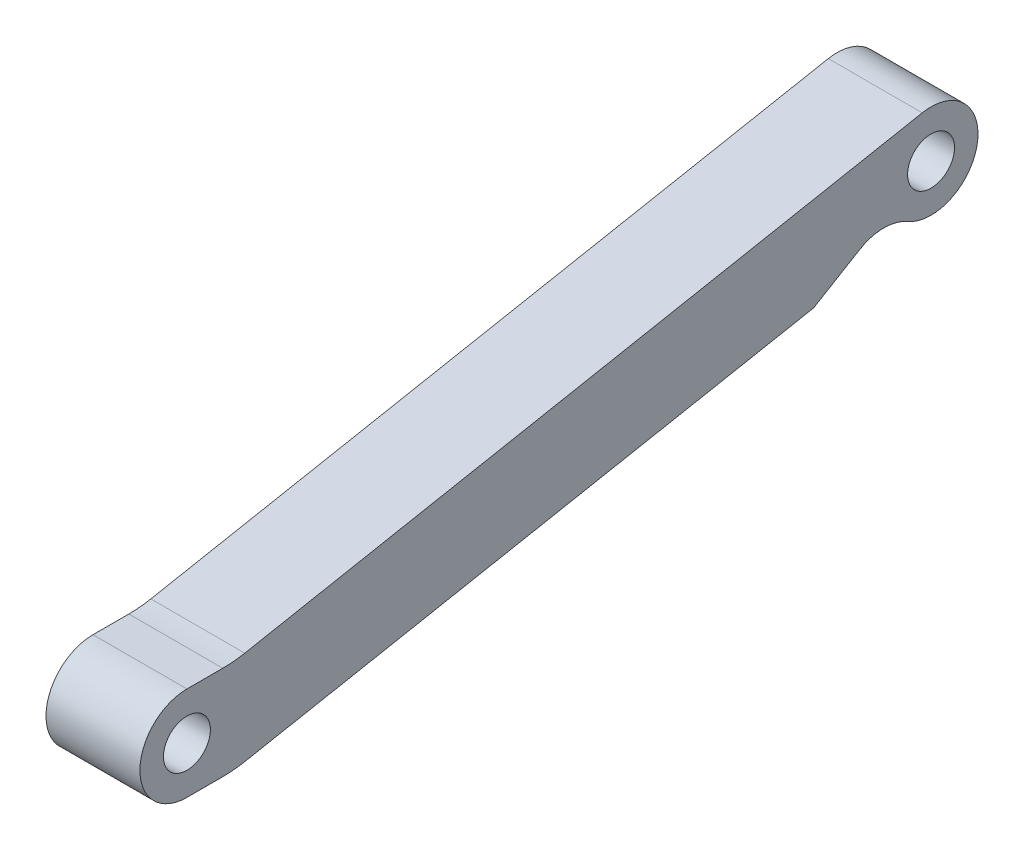
ISO-10303-21;
HEADER;
FILE_DESCRIPTION(('STEP AP214'),'2;1');
FILE_NAME('part.step','',(''),(''),'','','');
FILE_SCHEMA(('AUTOMOTIVE_DESIGN { 1 0 10303 214 1 1 1 1 }'));
ENDSEC;
DATA;
#1=APPLICATION_CONTEXT('core data for automotive mechanical design processes');
#2=APPLICATION_PROTOCOL_DEFINITION('international standard','automotive_design',2000,#1);
#3=PRODUCT_CONTEXT('',#1,'mechanical');
#4=PRODUCT('Part','Part','',(#3));
#5=PRODUCT_RELATED_PRODUCT_CATEGORY('part','',(#4));
#6=PRODUCT_DEFINITION_FORMATION('','',#4);
#7=PRODUCT_DEFINITION_CONTEXT('part definition',#1,'design');
#8=PRODUCT_DEFINITION('design','',#6,#7);
#9=PRODUCT_DEFINITION_SHAPE('','',#8);
#10=(LENGTH_UNIT() NAMED_UNIT(*) SI_UNIT(.MILLI.,.METRE.));
#11=(NAMED_UNIT(*) PLANE_ANGLE_UNIT() SI_UNIT($,.RADIAN.));
#12=(NAMED_UNIT(*) SI_UNIT($,.STERADIAN.) SOLID_ANGLE_UNIT());
#13=UNCERTAINTY_MEASURE_WITH_UNIT(LENGTH_MEASURE(1.E-05),#10,'distance_accuracy_value','');
#14=(GEOMETRIC_REPRESENTATION_CONTEXT(3) GLOBAL_UNCERTAINTY_ASSIGNED_CONTEXT((#13)) GLOBAL_UNIT_ASSIGNED_CONTEXT((#10,
#11,#12)) REPRESENTATION_CONTEXT('',''));
#15=CARTESIAN_POINT('',(0.,0.,0.));
#16=DIRECTION('',(0.,0.,1.));
#17=DIRECTION('',(1.,0.,0.));
#18=AXIS2_PLACEMENT_3D('',#15,#16,#17);
#19=CARTESIAN_POINT('',(-2.,-1.83592650414408,-78.7384748278499));
#20=DIRECTION('',(1.,0.,0.));
#21=DIRECTION('',(0.,0.,-1.));
#22=AXIS2_PLACEMENT_3D('',#19,#20,#21);
#23=CYLINDRICAL_SURFACE('',#22,2.00000000000001);
#24=DIRECTION('',(1.,0.,0.));
#25=VECTOR('',#24,1.);
#26=CARTESIAN_POINT('',(-2.,-0.105463252072049,-79.7412195277752));
#27=LINE('',#26,#25);
#28=CARTESIAN_POINT('',(-2.,-0.105463252072049,-79.7412195277752));
#29=VERTEX_POINT('',#28);
#30=CARTESIAN_POINT('',(2.,-0.105463252072049,-79.7412195277752));
#31=VERTEX_POINT('',#30);
#32=EDGE_CURVE('E42',#29,#31,#27,.T.);
#33=ORIENTED_EDGE('',*,*,#32,.T.);
#34=CARTESIAN_POINT('',(2.,-1.83592650414408,-78.7384748278499));
#35=DIRECTION('',(1.,0.,0.));
#36=DIRECTION('',(0.,0.,-1.));
#37=AXIS2_PLACEMENT_3D('',#34,#35,#36);
#38=CIRCLE('',#37,2.00000000000001);
#39=CARTESIAN_POINT('',(2.,-0.117948325049931,-77.7144870465964));
#40=VERTEX_POINT('',#39);
#41=EDGE_CURVE('E119',#31,#40,#38,.T.);
#42=ORIENTED_EDGE('',*,*,#41,.T.);
#43=DIRECTION('',(1.,0.,0.));
#44=VECTOR('',#43,1.);
#45=CARTESIAN_POINT('',(-2.,-0.117948325049931,-77.7144870465964));
#46=LINE('',#45,#44);
#47=CARTESIAN_POINT('',(-2.,-0.117948325049931,-77.7144870465964));
#48=VERTEX_POINT('',#47);
#49=EDGE_CURVE('E11',#48,#40,#46,.T.);
#50=ORIENTED_EDGE('',*,*,#49,.F.);
#51=CARTESIAN_POINT('',(-2.,-1.83592650414408,-78.7384748278499));
#52=DIRECTION('',(1.,0.,0.));
#53=DIRECTION('',(0.,0.,-1.));
#54=AXIS2_PLACEMENT_3D('',#51,#52,#53);
#55=CIRCLE('',#54,2.00000000000001);
#56=EDGE_CURVE('E55',#29,#48,#55,.T.);
#57=ORIENTED_EDGE('',*,*,#56,.F.);
#58=EDGE_LOOP('',(#33,#42,#50,#57));
#59=FACE_BOUND('',#58,.T.);
#60=ADVANCED_FACE('F38',(#59),#23,.F.);
#61=CARTESIAN_POINT('',(-2.,-34.2656407745785,-20.4237736526372));
#62=DIRECTION('',(0.,-0.858989089547071,-0.511993890626728));
#63=DIRECTION('',(0.,0.511993890626728,-0.858989089547071));
#64=AXIS2_PLACEMENT_3D('',#61,#62,#63);
#65=PLANE('',#64);
#66=ORIENTED_EDGE('',*,*,#49,.T.);
#67=DIRECTION('',(0.,0.511993890626728,-0.858989089547071));
#68=VECTOR('',#67,1.);
#69=CARTESIAN_POINT('',(2.,-34.2656407745785,-20.4237736526372));
#70=LINE('',#69,#68);
#71=CARTESIAN_POINT('',(2.,-1.29246341132096,-75.7439642277005));
#72=VERTEX_POINT('',#71);
#73=EDGE_CURVE('E136',#72,#40,#70,.T.);
#74=ORIENTED_EDGE('',*,*,#73,.F.);
#75=DIRECTION('',(1.,0.,0.));
#76=VECTOR('',#75,1.);
#77=CARTESIAN_POINT('',(-2.,-1.29246341132096,-75.7439642277005));
#78=LINE('',#77,#76);
#79=CARTESIAN_POINT('',(-2.,-1.29246341132096,-75.7439642277005));
#80=VERTEX_POINT('',#79);
#81=EDGE_CURVE('E47',#80,#72,#78,.T.);
#82=ORIENTED_EDGE('',*,*,#81,.F.);
#83=DIRECTION('',(0.,0.511993890626728,-0.858989089547071));
#84=VECTOR('',#83,1.);
#85=CARTESIAN_POINT('',(-2.,-34.2656407745785,-20.4237736526372));
#86=LINE('',#85,#84);
#87=EDGE_CURVE('E123',#80,#48,#86,.T.);
#88=ORIENTED_EDGE('',*,*,#87,.T.);
#89=EDGE_LOOP('',(#66,#74,#82,#88));
#90=FACE_BOUND('',#89,.T.);
#91=ADVANCED_FACE('F231',(#90),#65,.T.);
#92=CARTESIAN_POINT('',(-2.,-15.184700993753,-2.89573938527255));
#93=DIRECTION('',(0.,-0.98229793263701,-0.187325309387324));
#94=DIRECTION('',(0.,0.187325309387324,-0.98229793263701));
#95=AXIS2_PLACEMENT_3D('',#92,#93,#94);
#96=PLANE('',#95);
#97=ORIENTED_EDGE('',*,*,#81,.T.);
#98=DIRECTION('',(0.,0.187325309387324,-0.98229793263701));
#99=VECTOR('',#98,1.);
#100=CARTESIAN_POINT('',(2.,-15.184700993753,-2.89573938527255));
#101=LINE('',#100,#99);
#102=CARTESIAN_POINT('',(2.,-5.91148966318505,-51.5226779912492));
#103=VERTEX_POINT('',#102);
#104=EDGE_CURVE('E160',#103,#72,#101,.T.);
#105=ORIENTED_EDGE('',*,*,#104,.F.);
#106=DIRECTION('',(1.,0.,0.));
#107=VECTOR('',#106,1.);
#108=CARTESIAN_POINT('',(-2.,-5.91148966318505,-51.5226779912492));
#109=LINE('',#108,#107);
#110=CARTESIAN_POINT('',(-2.,-5.91148966318505,-51.5226779912492));
#111=VERTEX_POINT('',#110);
#112=EDGE_CURVE('E191',#111,#103,#109,.T.);
#113=ORIENTED_EDGE('',*,*,#112,.F.);
#114=DIRECTION('',(0.,0.187325309387324,-0.98229793263701));
#115=VECTOR('',#114,1.);
#116=CARTESIAN_POINT('',(-2.,-15.184700993753,-2.89573938527255));
#117=LINE('',#116,#115);
#118=EDGE_CURVE('E187',#111,#80,#117,.T.);
#119=ORIENTED_EDGE('',*,*,#118,.T.);
#120=EDGE_LOOP('',(#97,#105,#113,#119));
#121=FACE_BOUND('',#120,.T.);
#122=ADVANCED_FACE('F229',(#121),#96,.T.);
#123=CARTESIAN_POINT('',(-2.,-1.00000000000001,-50.5860514443126));
#124=DIRECTION('',(1.,0.,0.));
#125=DIRECTION('',(0.,0.,-1.));
#126=AXIS2_PLACEMENT_3D('',#123,#124,#125);
#127=CYLINDRICAL_SURFACE('',#126,5.);
#128=ORIENTED_EDGE('',*,*,#112,.T.);
#129=CARTESIAN_POINT('',(2.,-1.00000000000001,-50.5860514443126));
#130=DIRECTION('',(1.,0.,0.));
#131=DIRECTION('',(0.,0.,-1.));
#132=AXIS2_PLACEMENT_3D('',#129,#130,#131);
#133=CIRCLE('',#132,5.);
#134=CARTESIAN_POINT('',(2.,-6.00000000000001,-50.5860514443126));
#135=VERTEX_POINT('',#134);
#136=EDGE_CURVE('E157',#135,#103,#133,.T.);
#137=ORIENTED_EDGE('',*,*,#136,.F.);
#138=DIRECTION('',(1.,0.,0.));
#139=VECTOR('',#138,1.);
#140=CARTESIAN_POINT('',(-2.,-6.00000000000001,-50.5860514443126));
#141=LINE('',#140,#139);
#142=CARTESIAN_POINT('',(-2.,-6.00000000000001,-50.5860514443126));
#143=VERTEX_POINT('',#142);
#144=EDGE_CURVE('E193',#143,#135,#141,.T.);
#145=ORIENTED_EDGE('',*,*,#144,.F.);
#146=CARTESIAN_POINT('',(-2.,-1.00000000000001,-50.5860514443126));
#147=DIRECTION('',(1.,0.,0.));
#148=DIRECTION('',(0.,0.,-1.));
#149=AXIS2_PLACEMENT_3D('',#146,#147,#148);
#150=CIRCLE('',#149,5.);
#151=EDGE_CURVE('E184',#143,#111,#150,.T.);
#152=ORIENTED_EDGE('',*,*,#151,.T.);
#153=EDGE_LOOP('',(#128,#137,#145,#152));
#154=FACE_BOUND('',#153,.T.);
#155=ADVANCED_FACE('F226',(#154),#127,.T.);
#156=CARTESIAN_POINT('',(-2.,-6.00000000000003,0.));
#157=DIRECTION('',(0.,-1.,0.));
#158=DIRECTION('',(0.,0.,-1.));
#159=AXIS2_PLACEMENT_3D('',#156,#157,#158);
#160=PLANE('',#159);
#161=ORIENTED_EDGE('',*,*,#144,.T.);
#162=DIRECTION('',(0.,0.,-1.));
#163=VECTOR('',#162,1.);
#164=CARTESIAN_POINT('',(2.,-6.00000000000003,0.));
#165=LINE('',#164,#163);
#166=CARTESIAN_POINT('',(2.,-6.00000000000001,-49.05854679));
#167=VERTEX_POINT('',#166);
#168=EDGE_CURVE('E154',#167,#135,#165,.T.);
#169=ORIENTED_EDGE('',*,*,#168,.F.);
#170=DIRECTION('',(1.,0.,0.));
#171=VECTOR('',#170,1.);
#172=CARTESIAN_POINT('',(-2.,-6.00000000000001,-49.05854679));
#173=LINE('',#172,#171);
#174=CARTESIAN_POINT('',(-2.,-6.00000000000001,-49.05854679));
#175=VERTEX_POINT('',#174);
#176=EDGE_CURVE('E195',#175,#167,#173,.T.);
#177=ORIENTED_EDGE('',*,*,#176,.F.);
#178=DIRECTION('',(0.,0.,-1.));
#179=VECTOR('',#178,1.);
#180=CARTESIAN_POINT('',(-2.,-6.00000000000003,0.));
#181=LINE('',#180,#179);
#182=EDGE_CURVE('E181',#175,#143,#181,.T.);
#183=ORIENTED_EDGE('',*,*,#182,.T.);
#184=EDGE_LOOP('',(#161,#169,#177,#183));
#185=FACE_BOUND('',#184,.T.);
#186=ADVANCED_FACE('F222',(#185),#160,.T.);
#187=CARTESIAN_POINT('',(-2.,-4.00000000000001,-49.05854679));
#188=DIRECTION('',(1.,0.,0.));
#189=DIRECTION('',(0.,0.,-1.));
#190=AXIS2_PLACEMENT_3D('',#187,#188,#189);
#191=CYLINDRICAL_SURFACE('',#190,2.);
#192=ORIENTED_EDGE('',*,*,#176,.T.);
#193=CARTESIAN_POINT('',(2.,-4.00000000000001,-49.05854679));
#194=DIRECTION('',(1.,0.,0.));
#195=DIRECTION('',(0.,0.,-1.));
#196=AXIS2_PLACEMENT_3D('',#193,#194,#195);
#197=CIRCLE('',#196,2.);
#198=CARTESIAN_POINT('',(2.,-2.00000000000001,-49.05854679));
#199=VERTEX_POINT('',#198);
#200=EDGE_CURVE('E151',#199,#167,#197,.T.);
#201=ORIENTED_EDGE('',*,*,#200,.F.);
#202=DIRECTION('',(1.,0.,0.));
#203=VECTOR('',#202,1.);
#204=CARTESIAN_POINT('',(-2.,-2.00000000000001,-49.05854679));
#205=LINE('',#204,#203);
#206=CARTESIAN_POINT('',(-2.,-2.00000000000001,-49.05854679));
#207=VERTEX_POINT('',#206);
#208=EDGE_CURVE('E197',#207,#199,#205,.T.);
#209=ORIENTED_EDGE('',*,*,#208,.F.);
#210=CARTESIAN_POINT('',(-2.,-4.00000000000001,-49.05854679));
#211=DIRECTION('',(1.,0.,0.));
#212=DIRECTION('',(0.,0.,-1.));
#213=AXIS2_PLACEMENT_3D('',#210,#211,#212);
#214=CIRCLE('',#213,2.);
#215=EDGE_CURVE('E178',#207,#175,#214,.T.);
#216=ORIENTED_EDGE('',*,*,#215,.T.);
#217=EDGE_LOOP('',(#192,#201,#209,#216));
#218=FACE_BOUND('',#217,.T.);
#219=ADVANCED_FACE('F219',(#218),#191,.T.);
#220=CARTESIAN_POINT('',(-2.,-1.99999999999998,0.));
#221=DIRECTION('',(0.,-1.,0.));
#222=DIRECTION('',(0.,0.,-1.));
#223=AXIS2_PLACEMENT_3D('',#220,#221,#222);
#224=PLANE('',#223);
#225=ORIENTED_EDGE('',*,*,#208,.T.);
#226=DIRECTION('',(0.,0.,-1.));
#227=VECTOR('',#226,1.);
#228=CARTESIAN_POINT('',(2.,-1.99999999999998,0.));
#229=LINE('',#228,#227);
#230=CARTESIAN_POINT('',(2.,-2.00000000000001,-50.5860514443126));
#231=VERTEX_POINT('',#230);
#232=EDGE_CURVE('E148',#199,#231,#229,.T.);
#233=ORIENTED_EDGE('',*,*,#232,.T.);
#234=DIRECTION('',(1.,0.,0.));
#235=VECTOR('',#234,1.);
#236=CARTESIAN_POINT('',(-2.,-2.00000000000001,-50.5860514443126));
#237=LINE('',#236,#235);
#238=CARTESIAN_POINT('',(-2.,-2.00000000000001,-50.5860514443126));
#239=VERTEX_POINT('',#238);
#240=EDGE_CURVE('E199',#239,#231,#237,.T.);
#241=ORIENTED_EDGE('',*,*,#240,.F.);
#242=DIRECTION('',(0.,0.,-1.));
#243=VECTOR('',#242,1.);
#244=CARTESIAN_POINT('',(-2.,-1.99999999999998,0.));
#245=LINE('',#244,#243);
#246=EDGE_CURVE('E176',#207,#239,#245,.T.);
#247=ORIENTED_EDGE('',*,*,#246,.F.);
#248=EDGE_LOOP('',(#225,#233,#241,#247));
#249=FACE_BOUND('',#248,.T.);
#250=ADVANCED_FACE('F214',(#249),#224,.F.);
#251=CARTESIAN_POINT('',(-2.,2.99999999999999,-50.5860514443126));
#252=DIRECTION('',(1.,0.,0.));
#253=DIRECTION('',(0.,0.,-1.));
#254=AXIS2_PLACEMENT_3D('',#251,#252,#253);
#255=CYLINDRICAL_SURFACE('',#254,5.);
#256=ORIENTED_EDGE('',*,*,#240,.T.);
#257=CARTESIAN_POINT('',(2.,2.99999999999999,-50.5860514443126));
#258=DIRECTION('',(1.,0.,0.));
#259=DIRECTION('',(0.,0.,-1.));
#260=AXIS2_PLACEMENT_3D('',#257,#258,#259);
#261=CIRCLE('',#260,5.);
#262=CARTESIAN_POINT('',(2.,-1.91148966318506,-51.5226779912492));
#263=VERTEX_POINT('',#262);
#264=EDGE_CURVE('E145',#231,#263,#261,.T.);
#265=ORIENTED_EDGE('',*,*,#264,.T.);
#266=DIRECTION('',(1.,0.,0.));
#267=VECTOR('',#266,1.);
#268=CARTESIAN_POINT('',(-2.,-1.91148966318506,-51.5226779912492));
#269=LINE('',#268,#267);
#270=CARTESIAN_POINT('',(-2.,-1.91148966318506,-51.5226779912492));
#271=VERTEX_POINT('',#270);
#272=EDGE_CURVE('E201',#271,#263,#269,.T.);
#273=ORIENTED_EDGE('',*,*,#272,.F.);
#274=CARTESIAN_POINT('',(-2.,2.99999999999999,-50.5860514443126));
#275=DIRECTION('',(1.,0.,0.));
#276=DIRECTION('',(0.,0.,-1.));
#277=AXIS2_PLACEMENT_3D('',#274,#275,#276);
#278=CIRCLE('',#277,5.);
#279=EDGE_CURVE('E174',#239,#271,#278,.T.);
#280=ORIENTED_EDGE('',*,*,#279,.F.);
#281=EDGE_LOOP('',(#256,#265,#273,#280));
#282=FACE_BOUND('',#281,.T.);
#283=ADVANCED_FACE('F210',(#282),#255,.F.);
#284=CARTESIAN_POINT('',(-2.,-11.3250640799012,-2.15970232870552));
#285=DIRECTION('',(0.,-0.98229793263701,-0.187325309387324));
#286=DIRECTION('',(0.,0.187325309387324,-0.98229793263701));
#287=AXIS2_PLACEMENT_3D('',#284,#285,#286);
#288=PLANE('',#287);
#289=ORIENTED_EDGE('',*,*,#272,.T.);
#290=DIRECTION('',(0.,0.187325309387324,-0.98229793263701));
#291=VECTOR('',#290,1.);
#292=CARTESIAN_POINT('',(2.,-11.3250640799012,-2.15970232870552));
#293=LINE('',#292,#291);
#294=CARTESIAN_POINT('',(2.,3.58959586527398,-80.3693136089259));
#295=VERTEX_POINT('',#294);
#296=EDGE_CURVE('E131',#263,#295,#293,.T.);
#297=ORIENTED_EDGE('',*,*,#296,.T.);
#298=DIRECTION('',(1.,0.,0.));
#299=VECTOR('',#298,1.);
#300=CARTESIAN_POINT('',(-2.,3.58959586527398,-80.3693136089259));
#301=LINE('',#300,#299);
#302=CARTESIAN_POINT('',(-2.,3.58959586527398,-80.3693136089259));
#303=VERTEX_POINT('',#302);
#304=EDGE_CURVE('E122',#303,#295,#301,.T.);
#305=ORIENTED_EDGE('',*,*,#304,.F.);
#306=DIRECTION('',(0.,0.187325309387324,-0.98229793263701));
#307=VECTOR('',#306,1.);
#308=CARTESIAN_POINT('',(-2.,-11.3250640799012,-2.15970232870552));
#309=LINE('',#308,#307);
#310=EDGE_CURVE('E172',#271,#303,#309,.T.);
#311=ORIENTED_EDGE('',*,*,#310,.F.);
#312=EDGE_LOOP('',(#289,#297,#305,#311));
#313=FACE_BOUND('',#312,.T.);
#314=ADVANCED_FACE('F205',(#313),#288,.F.);
#315=CARTESIAN_POINT('',(-2.,1.62499999999996,-80.7439642277006));
#316=DIRECTION('',(1.,0.,0.));
#317=DIRECTION('',(0.,0.,-1.));
#318=AXIS2_PLACEMENT_3D('',#315,#316,#317);
#319=CYLINDRICAL_SURFACE('',#318,1.00000000000001);
#320=CARTESIAN_POINT('',(-2.,1.62499999999996,-80.7439642277006));
#321=DIRECTION('',(1.,0.,0.));
#322=DIRECTION('',(0.,0.,-1.));
#323=AXIS2_PLACEMENT_3D('',#320,#321,#322);
#324=CIRCLE('',#323,1.00000000000001);
#325=CARTESIAN_POINT('',(-2.,1.62499999999996,-81.7439642277006));
#326=VERTEX_POINT('',#325);
#327=EDGE_CURVE('E166',#326,#326,#324,.T.);
#328=ORIENTED_EDGE('',*,*,#327,.F.);
#329=EDGE_LOOP('',(#328));
#330=FACE_BOUND('',#329,.T.);
#331=CARTESIAN_POINT('',(2.,1.62499999999996,-80.7439642277006));
#332=DIRECTION('',(1.,0.,0.));
#333=DIRECTION('',(0.,0.,-1.));
#334=AXIS2_PLACEMENT_3D('',#331,#332,#333);
#335=CIRCLE('',#334,1.00000000000001);
#336=CARTESIAN_POINT('',(2.,1.62499999999996,-81.7439642277006));
#337=VERTEX_POINT('',#336);
#338=EDGE_CURVE('E137',#337,#337,#335,.T.);
#339=ORIENTED_EDGE('',*,*,#338,.T.);
#340=EDGE_LOOP('',(#339));
#341=FACE_BOUND('',#340,.T.);
#342=ADVANCED_FACE('F251',(#330,#341),#319,.F.);
#343=CARTESIAN_POINT('',(-2.,-4.00000000000001,-49.05854679));
#344=DIRECTION('',(1.,0.,0.));
#345=DIRECTION('',(0.,0.,-1.));
#346=AXIS2_PLACEMENT_3D('',#343,#344,#345);
#347=CYLINDRICAL_SURFACE('',#346,1.00000000000001);
#348=CARTESIAN_POINT('',(-2.,-4.00000000000001,-49.05854679));
#349=DIRECTION('',(1.,0.,0.));
#350=DIRECTION('',(0.,0.,-1.));
#351=AXIS2_PLACEMENT_3D('',#348,#349,#350);
#352=CIRCLE('',#351,1.00000000000001);
#353=CARTESIAN_POINT('',(-2.,-4.00000000000001,-50.05854679));
#354=VERTEX_POINT('',#353);
#355=EDGE_CURVE('E163',#354,#354,#352,.T.);
#356=ORIENTED_EDGE('',*,*,#355,.F.);
#357=EDGE_LOOP('',(#356));
#358=FACE_BOUND('',#357,.T.);
#359=CARTESIAN_POINT('',(2.,-4.00000000000001,-49.05854679));
#360=DIRECTION('',(1.,0.,0.));
#361=DIRECTION('',(0.,0.,-1.));
#362=AXIS2_PLACEMENT_3D('',#359,#360,#361);
#363=CIRCLE('',#362,1.00000000000001);
#364=CARTESIAN_POINT('',(2.,-4.00000000000001,-50.05854679));
#365=VERTEX_POINT('',#364);
#366=EDGE_CURVE('E140',#365,#365,#363,.T.);
#367=ORIENTED_EDGE('',*,*,#366,.T.);
#368=EDGE_LOOP('',(#367));
#369=FACE_BOUND('',#368,.T.);
#370=ADVANCED_FACE('F40',(#358,#369),#347,.F.);
#371=CARTESIAN_POINT('',(-2.,1.62499999999996,-80.7439642277006));
#372=DIRECTION('',(1.,0.,0.));
#373=DIRECTION('',(0.,0.,-1.));
#374=AXIS2_PLACEMENT_3D('',#371,#372,#373);
#375=CYLINDRICAL_SURFACE('',#374,2.);
#376=ORIENTED_EDGE('',*,*,#304,.T.);
#377=CARTESIAN_POINT('',(2.,1.62499999999996,-80.7439642277006));
#378=DIRECTION('',(1.,0.,0.));
#379=DIRECTION('',(0.,0.,-1.));
#380=AXIS2_PLACEMENT_3D('',#377,#378,#379);
#381=CIRCLE('',#380,2.);
#382=EDGE_CURVE('E125',#31,#295,#381,.T.);
#383=ORIENTED_EDGE('',*,*,#382,.F.);
#384=ORIENTED_EDGE('',*,*,#32,.F.);
#385=CARTESIAN_POINT('',(-2.,1.62499999999996,-80.7439642277006));
#386=DIRECTION('',(1.,0.,0.));
#387=DIRECTION('',(0.,0.,-1.));
#388=AXIS2_PLACEMENT_3D('',#385,#386,#387);
#389=CIRCLE('',#388,2.);
#390=EDGE_CURVE('E170',#29,#303,#389,.T.);
#391=ORIENTED_EDGE('',*,*,#390,.T.);
#392=EDGE_LOOP('',(#376,#383,#384,#391));
#393=FACE_BOUND('',#392,.T.);
#394=ADVANCED_FACE('F126',(#393),#375,.T.);
#395=CARTESIAN_POINT('',(-2.,0.,0.));
#396=DIRECTION('',(1.,0.,0.));
#397=DIRECTION('',(0.,0.,-1.));
#398=AXIS2_PLACEMENT_3D('',#395,#396,#397);
#399=PLANE('',#398);
#400=ORIENTED_EDGE('',*,*,#355,.T.);
#401=EDGE_LOOP('',(#400));
#402=FACE_BOUND('',#401,.T.);
#403=ORIENTED_EDGE('',*,*,#327,.T.);
#404=EDGE_LOOP('',(#403));
#405=FACE_BOUND('',#404,.T.);
#406=ORIENTED_EDGE('',*,*,#56,.T.);
#407=ORIENTED_EDGE('',*,*,#87,.F.);
#408=ORIENTED_EDGE('',*,*,#118,.F.);
#409=ORIENTED_EDGE('',*,*,#151,.F.);
#410=ORIENTED_EDGE('',*,*,#182,.F.);
#411=ORIENTED_EDGE('',*,*,#215,.F.);
#412=ORIENTED_EDGE('',*,*,#246,.T.);
#413=ORIENTED_EDGE('',*,*,#279,.T.);
#414=ORIENTED_EDGE('',*,*,#310,.T.);
#415=ORIENTED_EDGE('',*,*,#390,.F.);
#416=EDGE_LOOP('',(#406,#407,#408,#409,#410,#411,#412,#413,#414,#415));
#417=FACE_BOUND('',#416,.T.);
#418=ADVANCED_FACE('F232',(#402,#405,#417),#399,.F.);
#419=CARTESIAN_POINT('',(2.,0.,0.));
#420=DIRECTION('',(1.,0.,0.));
#421=DIRECTION('',(0.,0.,-1.));
#422=AXIS2_PLACEMENT_3D('',#419,#420,#421);
#423=PLANE('',#422);
#424=ORIENTED_EDGE('',*,*,#366,.F.);
#425=EDGE_LOOP('',(#424));
#426=FACE_BOUND('',#425,.T.);
#427=ORIENTED_EDGE('',*,*,#338,.F.);
#428=EDGE_LOOP('',(#427));
#429=FACE_BOUND('',#428,.T.);
#430=ORIENTED_EDGE('',*,*,#41,.F.);
#431=ORIENTED_EDGE('',*,*,#382,.T.);
#432=ORIENTED_EDGE('',*,*,#296,.F.);
#433=ORIENTED_EDGE('',*,*,#264,.F.);
#434=ORIENTED_EDGE('',*,*,#232,.F.);
#435=ORIENTED_EDGE('',*,*,#200,.T.);
#436=ORIENTED_EDGE('',*,*,#168,.T.);
#437=ORIENTED_EDGE('',*,*,#136,.T.);
#438=ORIENTED_EDGE('',*,*,#104,.T.);
#439=ORIENTED_EDGE('',*,*,#73,.T.);
#440=EDGE_LOOP('',(#430,#431,#432,#433,#434,#435,#436,#437,#438,#439));
#441=FACE_BOUND('',#440,.T.);
#442=ADVANCED_FACE('F134',(#426,#429,#441),#423,.T.);
#443=CLOSED_SHELL('',(#60,#91,#122,#155,#186,#219,#250,#283,#314,#342,#370,#394,#418,#442));
#444=MANIFOLD_SOLID_BREP('B2',#443);
#445=ADVANCED_BREP_SHAPE_REPRESENTATION('',(#18,#444),#14);
#446=SHAPE_DEFINITION_REPRESENTATION(#9,#445);
ENDSEC;
END-ISO-10303-21;
